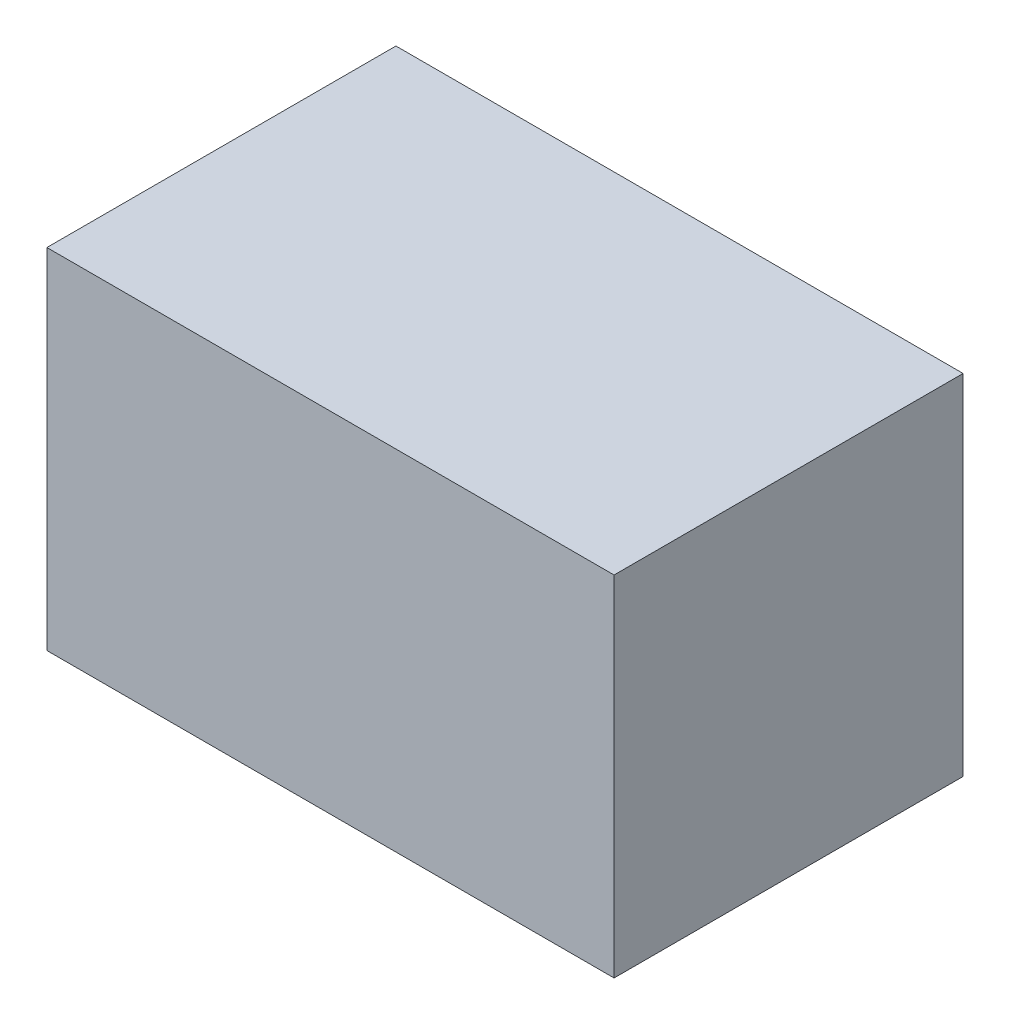
ISO-10303-21;
HEADER;
FILE_DESCRIPTION(('STEP AP214'),'2;1');
FILE_NAME('part.step','',(''),(''),'','','');
FILE_SCHEMA(('AUTOMOTIVE_DESIGN { 1 0 10303 214 1 1 1 1 }'));
ENDSEC;
DATA;
#1=APPLICATION_CONTEXT('core data for automotive mechanical design processes');
#2=APPLICATION_PROTOCOL_DEFINITION('international standard','automotive_design',2000,#1);
#3=PRODUCT_CONTEXT('',#1,'mechanical');
#4=PRODUCT('Part','Part','',(#3));
#5=PRODUCT_RELATED_PRODUCT_CATEGORY('part','',(#4));
#6=PRODUCT_DEFINITION_FORMATION('','',#4);
#7=PRODUCT_DEFINITION_CONTEXT('part definition',#1,'design');
#8=PRODUCT_DEFINITION('design','',#6,#7);
#9=PRODUCT_DEFINITION_SHAPE('','',#8);
#10=(LENGTH_UNIT() NAMED_UNIT(*) SI_UNIT(.MILLI.,.METRE.));
#11=(NAMED_UNIT(*) PLANE_ANGLE_UNIT() SI_UNIT($,.RADIAN.));
#12=(NAMED_UNIT(*) SI_UNIT($,.STERADIAN.) SOLID_ANGLE_UNIT());
#13=UNCERTAINTY_MEASURE_WITH_UNIT(LENGTH_MEASURE(1.E-05),#10,'distance_accuracy_value','');
#14=(GEOMETRIC_REPRESENTATION_CONTEXT(3) GLOBAL_UNCERTAINTY_ASSIGNED_CONTEXT((#13)) GLOBAL_UNIT_ASSIGNED_CONTEXT((#10,
#11,#12)) REPRESENTATION_CONTEXT('',''));
#15=CARTESIAN_POINT('',(0.,0.,0.));
#16=DIRECTION('',(0.,0.,1.));
#17=DIRECTION('',(1.,0.,0.));
#18=AXIS2_PLACEMENT_3D('',#15,#16,#17);
#19=CARTESIAN_POINT('',(165.1,203.2,-101.6));
#20=DIRECTION('',(-1.,0.,0.));
#21=DIRECTION('',(0.,0.,1.));
#22=AXIS2_PLACEMENT_3D('',#19,#20,#21);
#23=PLANE('',#22);
#24=DIRECTION('',(0.,0.,-1.));
#25=VECTOR('',#24,1.);
#26=CARTESIAN_POINT('',(165.1,0.,-101.6));
#27=LINE('',#26,#25);
#28=CARTESIAN_POINT('',(165.1,0.,101.6));
#29=VERTEX_POINT('',#28);
#30=CARTESIAN_POINT('',(165.1,0.,-101.6));
#31=VERTEX_POINT('',#30);
#32=EDGE_CURVE('E116',#29,#31,#27,.T.);
#33=ORIENTED_EDGE('',*,*,#32,.T.);
#34=DIRECTION('',(0.,-1.,0.));
#35=VECTOR('',#34,1.);
#36=CARTESIAN_POINT('',(165.1,203.2,-101.6));
#37=LINE('',#36,#35);
#38=CARTESIAN_POINT('',(165.1,203.2,-101.6));
#39=VERTEX_POINT('',#38);
#40=EDGE_CURVE('E11',#39,#31,#37,.T.);
#41=ORIENTED_EDGE('',*,*,#40,.F.);
#42=DIRECTION('',(0.,0.,-1.));
#43=VECTOR('',#42,1.);
#44=CARTESIAN_POINT('',(165.1,203.2,-101.6));
#45=LINE('',#44,#43);
#46=CARTESIAN_POINT('',(165.1,203.2,101.6));
#47=VERTEX_POINT('',#46);
#48=EDGE_CURVE('E99',#47,#39,#45,.T.);
#49=ORIENTED_EDGE('',*,*,#48,.F.);
#50=DIRECTION('',(0.,-1.,0.));
#51=VECTOR('',#50,1.);
#52=CARTESIAN_POINT('',(165.1,203.2,101.6));
#53=LINE('',#52,#51);
#54=EDGE_CURVE('E112',#47,#29,#53,.T.);
#55=ORIENTED_EDGE('',*,*,#54,.T.);
#56=EDGE_LOOP('',(#33,#41,#49,#55));
#57=FACE_BOUND('',#56,.T.);
#58=ADVANCED_FACE('F47',(#57),#23,.F.);
#59=CARTESIAN_POINT('',(-165.1,203.2,-101.6));
#60=DIRECTION('',(0.,0.,1.));
#61=DIRECTION('',(1.,0.,0.));
#62=AXIS2_PLACEMENT_3D('',#59,#60,#61);
#63=PLANE('',#62);
#64=DIRECTION('',(-1.,0.,0.));
#65=VECTOR('',#64,1.);
#66=CARTESIAN_POINT('',(-165.1,0.,-101.6));
#67=LINE('',#66,#65);
#68=CARTESIAN_POINT('',(-165.1,0.,-101.6));
#69=VERTEX_POINT('',#68);
#70=EDGE_CURVE('E104',#31,#69,#67,.T.);
#71=ORIENTED_EDGE('',*,*,#70,.T.);
#72=DIRECTION('',(0.,-1.,0.));
#73=VECTOR('',#72,1.);
#74=CARTESIAN_POINT('',(-165.1,203.2,-101.6));
#75=LINE('',#74,#73);
#76=CARTESIAN_POINT('',(-165.1,203.2,-101.6));
#77=VERTEX_POINT('',#76);
#78=EDGE_CURVE('E56',#77,#69,#75,.T.);
#79=ORIENTED_EDGE('',*,*,#78,.F.);
#80=DIRECTION('',(-1.,0.,0.));
#81=VECTOR('',#80,1.);
#82=CARTESIAN_POINT('',(-165.1,203.2,-101.6));
#83=LINE('',#82,#81);
#84=EDGE_CURVE('E94',#39,#77,#83,.T.);
#85=ORIENTED_EDGE('',*,*,#84,.F.);
#86=ORIENTED_EDGE('',*,*,#40,.T.);
#87=EDGE_LOOP('',(#71,#79,#85,#86));
#88=FACE_BOUND('',#87,.T.);
#89=ADVANCED_FACE('F103',(#88),#63,.F.);
#90=CARTESIAN_POINT('',(-165.1,203.2,-101.6));
#91=DIRECTION('',(1.,0.,0.));
#92=DIRECTION('',(0.,0.,-1.));
#93=AXIS2_PLACEMENT_3D('',#90,#91,#92);
#94=PLANE('',#93);
#95=DIRECTION('',(0.,0.,1.));
#96=VECTOR('',#95,1.);
#97=CARTESIAN_POINT('',(-165.1,0.,-101.6));
#98=LINE('',#97,#96);
#99=CARTESIAN_POINT('',(-165.1,0.,101.6));
#100=VERTEX_POINT('',#99);
#101=EDGE_CURVE('E81',#69,#100,#98,.T.);
#102=ORIENTED_EDGE('',*,*,#101,.T.);
#103=DIRECTION('',(0.,-1.,0.));
#104=VECTOR('',#103,1.);
#105=CARTESIAN_POINT('',(-165.1,203.2,101.6));
#106=LINE('',#105,#104);
#107=CARTESIAN_POINT('',(-165.1,203.2,101.6));
#108=VERTEX_POINT('',#107);
#109=EDGE_CURVE('E106',#108,#100,#106,.T.);
#110=ORIENTED_EDGE('',*,*,#109,.F.);
#111=DIRECTION('',(0.,0.,1.));
#112=VECTOR('',#111,1.);
#113=CARTESIAN_POINT('',(-165.1,203.2,-101.6));
#114=LINE('',#113,#112);
#115=EDGE_CURVE('E97',#77,#108,#114,.T.);
#116=ORIENTED_EDGE('',*,*,#115,.F.);
#117=ORIENTED_EDGE('',*,*,#78,.T.);
#118=EDGE_LOOP('',(#102,#110,#116,#117));
#119=FACE_BOUND('',#118,.T.);
#120=ADVANCED_FACE('F107',(#119),#94,.F.);
#121=CARTESIAN_POINT('',(-165.1,203.2,101.6));
#122=DIRECTION('',(0.,0.,-1.));
#123=DIRECTION('',(-1.,0.,0.));
#124=AXIS2_PLACEMENT_3D('',#121,#122,#123);
#125=PLANE('',#124);
#126=DIRECTION('',(1.,0.,0.));
#127=VECTOR('',#126,1.);
#128=CARTESIAN_POINT('',(-165.1,0.,101.6));
#129=LINE('',#128,#127);
#130=EDGE_CURVE('E87',#100,#29,#129,.T.);
#131=ORIENTED_EDGE('',*,*,#130,.T.);
#132=ORIENTED_EDGE('',*,*,#54,.F.);
#133=DIRECTION('',(1.,0.,0.));
#134=VECTOR('',#133,1.);
#135=CARTESIAN_POINT('',(-165.1,203.2,101.6));
#136=LINE('',#135,#134);
#137=EDGE_CURVE('E64',#108,#47,#136,.T.);
#138=ORIENTED_EDGE('',*,*,#137,.F.);
#139=ORIENTED_EDGE('',*,*,#109,.T.);
#140=EDGE_LOOP('',(#131,#132,#138,#139));
#141=FACE_BOUND('',#140,.T.);
#142=ADVANCED_FACE('F130',(#141),#125,.F.);
#143=CARTESIAN_POINT('',(0.,203.2,0.));
#144=DIRECTION('',(0.,1.,0.));
#145=DIRECTION('',(0.,0.,1.));
#146=AXIS2_PLACEMENT_3D('',#143,#144,#145);
#147=PLANE('',#146);
#148=ORIENTED_EDGE('',*,*,#48,.T.);
#149=ORIENTED_EDGE('',*,*,#84,.T.);
#150=ORIENTED_EDGE('',*,*,#115,.T.);
#151=ORIENTED_EDGE('',*,*,#137,.T.);
#152=EDGE_LOOP('',(#148,#149,#150,#151));
#153=FACE_BOUND('',#152,.T.);
#154=ADVANCED_FACE('F95',(#153),#147,.T.);
#155=CARTESIAN_POINT('',(0.,0.,0.));
#156=DIRECTION('',(0.,1.,0.));
#157=DIRECTION('',(0.,0.,1.));
#158=AXIS2_PLACEMENT_3D('',#155,#156,#157);
#159=PLANE('',#158);
#160=ORIENTED_EDGE('',*,*,#32,.F.);
#161=ORIENTED_EDGE('',*,*,#130,.F.);
#162=ORIENTED_EDGE('',*,*,#101,.F.);
#163=ORIENTED_EDGE('',*,*,#70,.F.);
#164=EDGE_LOOP('',(#160,#161,#162,#163));
#165=FACE_BOUND('',#164,.T.);
#166=ADVANCED_FACE('F133',(#165),#159,.F.);
#167=CLOSED_SHELL('',(#58,#89,#120,#142,#154,#166));
#168=MANIFOLD_SOLID_BREP('B2',#167);
#169=ADVANCED_BREP_SHAPE_REPRESENTATION('',(#18,#168),#14);
#170=SHAPE_DEFINITION_REPRESENTATION(#9,#169);
ENDSEC;
END-ISO-10303-21;
